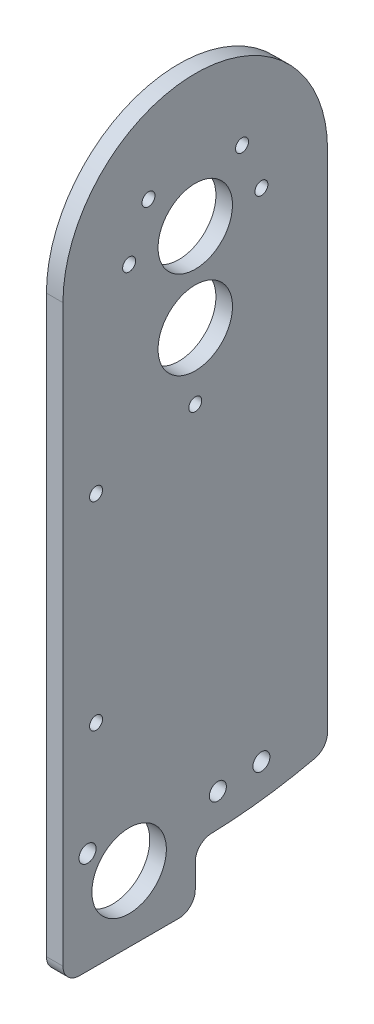
ISO-10303-21;
HEADER;
FILE_DESCRIPTION(('STEP AP214'),'2;1');
FILE_NAME('part.step','',(''),(''),'','','');
FILE_SCHEMA(('AUTOMOTIVE_DESIGN { 1 0 10303 214 1 1 1 1 }'));
ENDSEC;
DATA;
#1=APPLICATION_CONTEXT('core data for automotive mechanical design processes');
#2=APPLICATION_PROTOCOL_DEFINITION('international standard','automotive_design',2000,#1);
#3=PRODUCT_CONTEXT('',#1,'mechanical');
#4=PRODUCT('Part','Part','',(#3));
#5=PRODUCT_RELATED_PRODUCT_CATEGORY('part','',(#4));
#6=PRODUCT_DEFINITION_FORMATION('','',#4);
#7=PRODUCT_DEFINITION_CONTEXT('part definition',#1,'design');
#8=PRODUCT_DEFINITION('design','',#6,#7);
#9=PRODUCT_DEFINITION_SHAPE('','',#8);
#10=(LENGTH_UNIT() NAMED_UNIT(*) SI_UNIT(.MILLI.,.METRE.));
#11=(NAMED_UNIT(*) PLANE_ANGLE_UNIT() SI_UNIT($,.RADIAN.));
#12=(NAMED_UNIT(*) SI_UNIT($,.STERADIAN.) SOLID_ANGLE_UNIT());
#13=UNCERTAINTY_MEASURE_WITH_UNIT(LENGTH_MEASURE(1.E-05),#10,'distance_accuracy_value','');
#14=(GEOMETRIC_REPRESENTATION_CONTEXT(3) GLOBAL_UNCERTAINTY_ASSIGNED_CONTEXT((#13)) GLOBAL_UNIT_ASSIGNED_CONTEXT((#10,
#11,#12)) REPRESENTATION_CONTEXT('',''));
#15=CARTESIAN_POINT('',(0.,0.,0.));
#16=DIRECTION('',(0.,0.,1.));
#17=DIRECTION('',(1.,0.,0.));
#18=AXIS2_PLACEMENT_3D('',#15,#16,#17);
#19=CARTESIAN_POINT('',(6.35,0.,0.));
#20=DIRECTION('',(-1.,0.,0.));
#21=DIRECTION('',(0.,0.,1.));
#22=AXIS2_PLACEMENT_3D('',#19,#20,#21);
#23=PLANE('',#22);
#24=CARTESIAN_POINT('',(6.35,-201.606249903122,25.4));
#25=DIRECTION('',(-1.,0.,0.));
#26=DIRECTION('',(0.,0.,1.));
#27=AXIS2_PLACEMENT_3D('',#24,#25,#26);
#28=CIRCLE('',#27,14.2875);
#29=CARTESIAN_POINT('',(6.35,-201.606249903122,39.6875));
#30=VERTEX_POINT('',#29);
#31=EDGE_CURVE('E237',#30,#30,#28,.T.);
#32=ORIENTED_EDGE('',*,*,#31,.T.);
#33=EDGE_LOOP('',(#32));
#34=FACE_BOUND('',#33,.T.);
#35=CARTESIAN_POINT('',(6.34999999999999,0.,25.4));
#36=DIRECTION('',(-1.,0.,0.));
#37=DIRECTION('',(0.,0.,1.));
#38=AXIS2_PLACEMENT_3D('',#35,#36,#37);
#39=CIRCLE('',#38,2.48919999999999);
#40=CARTESIAN_POINT('',(6.34999999999999,0.,27.8892));
#41=VERTEX_POINT('',#40);
#42=EDGE_CURVE('E251',#41,#41,#39,.T.);
#43=ORIENTED_EDGE('',*,*,#42,.T.);
#44=EDGE_LOOP('',(#43));
#45=FACE_BOUND('',#44,.T.);
#46=CARTESIAN_POINT('',(6.34999999999999,0.,-25.4));
#47=DIRECTION('',(-1.,0.,0.));
#48=DIRECTION('',(0.,0.,1.));
#49=AXIS2_PLACEMENT_3D('',#46,#47,#48);
#50=CIRCLE('',#49,2.48919999999999);
#51=CARTESIAN_POINT('',(6.34999999999999,0.,-22.9108));
#52=VERTEX_POINT('',#51);
#53=EDGE_CURVE('E259',#52,#52,#50,.T.);
#54=ORIENTED_EDGE('',*,*,#53,.T.);
#55=EDGE_LOOP('',(#54));
#56=FACE_BOUND('',#55,.T.);
#57=CARTESIAN_POINT('',(6.34999999999999,17.9605122421383,-17.9605122421383));
#58=DIRECTION('',(-1.,0.,0.));
#59=DIRECTION('',(0.,0.,1.));
#60=AXIS2_PLACEMENT_3D('',#57,#58,#59);
#61=CIRCLE('',#60,2.48919999999999);
#62=CARTESIAN_POINT('',(6.34999999999999,17.9605122421383,-15.4713122421383));
#63=VERTEX_POINT('',#62);
#64=EDGE_CURVE('E267',#63,#63,#61,.T.);
#65=ORIENTED_EDGE('',*,*,#64,.T.);
#66=EDGE_LOOP('',(#65));
#67=FACE_BOUND('',#66,.T.);
#68=CARTESIAN_POINT('',(6.34999999999999,17.9605122421383,17.9605122421383));
#69=DIRECTION('',(-1.,0.,0.));
#70=DIRECTION('',(0.,0.,1.));
#71=AXIS2_PLACEMENT_3D('',#68,#69,#70);
#72=CIRCLE('',#71,2.48919999999999);
#73=CARTESIAN_POINT('',(6.34999999999999,17.9605122421383,20.4497122421383));
#74=VERTEX_POINT('',#73);
#75=EDGE_CURVE('E275',#74,#74,#72,.T.);
#76=ORIENTED_EDGE('',*,*,#75,.T.);
#77=EDGE_LOOP('',(#76));
#78=FACE_BOUND('',#77,.T.);
#79=CARTESIAN_POINT('',(6.34999999999999,-59.182,0.));
#80=DIRECTION('',(-1.,0.,0.));
#81=DIRECTION('',(0.,0.,1.));
#82=AXIS2_PLACEMENT_3D('',#79,#80,#81);
#83=CIRCLE('',#82,2.48919999999999);
#84=CARTESIAN_POINT('',(6.34999999999999,-59.182,2.48919999999999));
#85=VERTEX_POINT('',#84);
#86=EDGE_CURVE('E283',#85,#85,#83,.T.);
#87=ORIENTED_EDGE('',*,*,#86,.T.);
#88=EDGE_LOOP('',(#87));
#89=FACE_BOUND('',#88,.T.);
#90=CARTESIAN_POINT('',(6.35,-146.05,38.1));
#91=DIRECTION('',(1.,0.,0.));
#92=DIRECTION('',(0.,0.,-1.));
#93=AXIS2_PLACEMENT_3D('',#90,#91,#92);
#94=CIRCLE('',#93,2.4892);
#95=CARTESIAN_POINT('',(6.35,-146.05,35.6108));
#96=VERTEX_POINT('',#95);
#97=EDGE_CURVE('E287',#96,#96,#94,.T.);
#98=ORIENTED_EDGE('',*,*,#97,.F.);
#99=EDGE_LOOP('',(#98));
#100=FACE_BOUND('',#99,.T.);
#101=CARTESIAN_POINT('',(6.35,-69.85,38.1));
#102=DIRECTION('',(1.,0.,0.));
#103=DIRECTION('',(0.,0.,-1.));
#104=AXIS2_PLACEMENT_3D('',#101,#102,#103);
#105=CIRCLE('',#104,2.48919999999998);
#106=CARTESIAN_POINT('',(6.35,-69.85,35.6108));
#107=VERTEX_POINT('',#106);
#108=EDGE_CURVE('E295',#107,#107,#105,.T.);
#109=ORIENTED_EDGE('',*,*,#108,.F.);
#110=EDGE_LOOP('',(#109));
#111=FACE_BOUND('',#110,.T.);
#112=CARTESIAN_POINT('',(6.35,-192.209068040787,-8.68090939314916));
#113=DIRECTION('',(1.,0.,0.));
#114=DIRECTION('',(0.,0.,-1.));
#115=AXIS2_PLACEMENT_3D('',#112,#113,#114);
#116=CIRCLE('',#115,3.26389999999999);
#117=CARTESIAN_POINT('',(6.35,-192.209068040787,-11.9448093931491));
#118=VERTEX_POINT('',#117);
#119=EDGE_CURVE('E311',#118,#118,#116,.T.);
#120=ORIENTED_EDGE('',*,*,#119,.F.);
#121=EDGE_LOOP('',(#120));
#122=FACE_BOUND('',#121,.T.);
#123=CARTESIAN_POINT('',(6.35,-187.906487547305,41.362252871844));
#124=DIRECTION('',(1.,0.,0.));
#125=DIRECTION('',(0.,0.,-1.));
#126=AXIS2_PLACEMENT_3D('',#123,#124,#125);
#127=CIRCLE('',#126,3.26389999999999);
#128=CARTESIAN_POINT('',(6.35,-187.906487547305,38.098352871844));
#129=VERTEX_POINT('',#128);
#130=EDGE_CURVE('E319',#129,#129,#127,.T.);
#131=ORIENTED_EDGE('',*,*,#130,.F.);
#132=EDGE_LOOP('',(#131));
#133=FACE_BOUND('',#132,.T.);
#134=DIRECTION('',(0.,0.,-1.));
#135=VECTOR('',#134,1.);
#136=CARTESIAN_POINT('',(6.35,-227.006249903122,50.8));
#137=LINE('',#136,#135);
#138=CARTESIAN_POINT('',(6.35,-227.006249903122,44.4499999999999));
#139=VERTEX_POINT('',#138);
#140=CARTESIAN_POINT('',(6.35,-227.006249903122,6.35000000000001));
#141=VERTEX_POINT('',#140);
#142=EDGE_CURVE('E240',#139,#141,#137,.T.);
#143=ORIENTED_EDGE('',*,*,#142,.T.);
#144=CARTESIAN_POINT('',(6.35,-220.656249903122,6.35000000000001));
#145=DIRECTION('',(-1.,0.,0.));
#146=DIRECTION('',(0.,0.,1.));
#147=AXIS2_PLACEMENT_3D('',#144,#145,#146);
#148=CIRCLE('',#147,6.35);
#149=CARTESIAN_POINT('',(6.35,-220.656249903122,0.));
#150=VERTEX_POINT('',#149);
#151=EDGE_CURVE('E185',#141,#150,#148,.F.);
#152=ORIENTED_EDGE('',*,*,#151,.T.);
#153=DIRECTION('',(0.,1.,0.));
#154=VECTOR('',#153,1.);
#155=CARTESIAN_POINT('',(6.35,-227.006249903122,0.));
#156=LINE('',#155,#154);
#157=CARTESIAN_POINT('',(6.35,-211.359633149284,0.));
#158=VERTEX_POINT('',#157);
#159=EDGE_CURVE('E205',#150,#158,#156,.T.);
#160=ORIENTED_EDGE('',*,*,#159,.T.);
#161=CARTESIAN_POINT('',(6.35,-211.359633149284,-6.34999999999999));
#162=DIRECTION('',(-1.,0.,0.));
#163=DIRECTION('',(0.,0.,1.));
#164=AXIS2_PLACEMENT_3D('',#161,#162,#163);
#165=CIRCLE('',#164,6.35);
#166=CARTESIAN_POINT('',(6.35,-205.012497018675,-6.1593093093093));
#167=VERTEX_POINT('',#166);
#168=EDGE_CURVE('E54',#158,#167,#165,.T.);
#169=ORIENTED_EDGE('',*,*,#168,.T.);
#170=CARTESIAN_POINT('',(6.35,0.,0.));
#171=DIRECTION('',(1.,0.,0.));
#172=DIRECTION('',(0.,0.,-1.));
#173=AXIS2_PLACEMENT_3D('',#170,#171,#172);
#174=CIRCLE('',#173,205.105);
#175=CARTESIAN_POINT('',(6.35,-199.909960734882,-45.8701277955272));
#176=VERTEX_POINT('',#175);
#177=EDGE_CURVE('E135',#167,#176,#174,.T.);
#178=ORIENTED_EDGE('',*,*,#177,.T.);
#179=CARTESIAN_POINT('',(6.35,-193.720797863833,-44.45));
#180=DIRECTION('',(-1.,0.,0.));
#181=DIRECTION('',(0.,0.,1.));
#182=AXIS2_PLACEMENT_3D('',#179,#180,#181);
#183=CIRCLE('',#182,6.35);
#184=CARTESIAN_POINT('',(6.35,-193.720797863833,-50.8));
#185=VERTEX_POINT('',#184);
#186=EDGE_CURVE('E179',#176,#185,#183,.F.);
#187=ORIENTED_EDGE('',*,*,#186,.T.);
#188=DIRECTION('',(0.,1.,0.));
#189=VECTOR('',#188,1.);
#190=CARTESIAN_POINT('',(6.35,0.,-50.8));
#191=LINE('',#190,#189);
#192=CARTESIAN_POINT('',(6.35,0.,-50.8));
#193=VERTEX_POINT('',#192);
#194=EDGE_CURVE('E142',#185,#193,#191,.T.);
#195=ORIENTED_EDGE('',*,*,#194,.T.);
#196=CARTESIAN_POINT('',(6.35,0.,0.));
#197=DIRECTION('',(1.,0.,0.));
#198=DIRECTION('',(0.,0.,1.));
#199=AXIS2_PLACEMENT_3D('',#196,#197,#198);
#200=CIRCLE('',#199,50.8);
#201=CARTESIAN_POINT('',(6.35,0.,50.8));
#202=VERTEX_POINT('',#201);
#203=EDGE_CURVE('E136',#193,#202,#200,.T.);
#204=ORIENTED_EDGE('',*,*,#203,.T.);
#205=DIRECTION('',(0.,-1.,0.));
#206=VECTOR('',#205,1.);
#207=CARTESIAN_POINT('',(6.35,0.,50.8));
#208=LINE('',#207,#206);
#209=CARTESIAN_POINT('',(6.35,-220.656249903122,50.7999999999999));
#210=VERTEX_POINT('',#209);
#211=EDGE_CURVE('E125',#202,#210,#208,.T.);
#212=ORIENTED_EDGE('',*,*,#211,.T.);
#213=CARTESIAN_POINT('',(6.35,-220.656249903122,44.4499999999999));
#214=DIRECTION('',(-1.,0.,0.));
#215=DIRECTION('',(0.,0.,1.));
#216=AXIS2_PLACEMENT_3D('',#213,#214,#215);
#217=CIRCLE('',#216,6.35);
#218=EDGE_CURVE('E182',#210,#139,#217,.F.);
#219=ORIENTED_EDGE('',*,*,#218,.T.);
#220=EDGE_LOOP('',(#143,#152,#160,#169,#178,#187,#195,#204,#212,#219));
#221=FACE_BOUND('',#220,.T.);
#222=CARTESIAN_POINT('',(6.35,0.,0.));
#223=DIRECTION('',(1.,0.,0.));
#224=DIRECTION('',(0.,0.,-1.));
#225=AXIS2_PLACEMENT_3D('',#222,#223,#224);
#226=CIRCLE('',#225,14.2875);
#227=CARTESIAN_POINT('',(6.35,0.,-14.2875));
#228=VERTEX_POINT('',#227);
#229=EDGE_CURVE('E336',#228,#228,#226,.T.);
#230=ORIENTED_EDGE('',*,*,#229,.F.);
#231=EDGE_LOOP('',(#230));
#232=FACE_BOUND('',#231,.T.);
#233=CARTESIAN_POINT('',(6.35,-33.782,0.));
#234=DIRECTION('',(1.,0.,0.));
#235=DIRECTION('',(0.,0.,-1.));
#236=AXIS2_PLACEMENT_3D('',#233,#234,#235);
#237=CIRCLE('',#236,14.2875);
#238=CARTESIAN_POINT('',(6.35,-33.782,-14.2875));
#239=VERTEX_POINT('',#238);
#240=EDGE_CURVE('E328',#239,#239,#237,.T.);
#241=ORIENTED_EDGE('',*,*,#240,.F.);
#242=EDGE_LOOP('',(#241));
#243=FACE_BOUND('',#242,.T.);
#244=CARTESIAN_POINT('',(6.35,-190.721063401503,-25.4));
#245=DIRECTION('',(1.,0.,0.));
#246=DIRECTION('',(0.,0.,-1.));
#247=AXIS2_PLACEMENT_3D('',#244,#245,#246);
#248=CIRCLE('',#247,3.26389999999999);
#249=CARTESIAN_POINT('',(6.35,-190.721063401503,-28.6639));
#250=VERTEX_POINT('',#249);
#251=EDGE_CURVE('E303',#250,#250,#248,.T.);
#252=ORIENTED_EDGE('',*,*,#251,.F.);
#253=EDGE_LOOP('',(#252));
#254=FACE_BOUND('',#253,.T.);
#255=ADVANCED_FACE('F45',(#34,#45,#56,#67,#78,#89,#100,#111,#122,#133,#221,#232,#243,#254),#23,.F.);
#256=CARTESIAN_POINT('',(0.,0.,0.));
#257=DIRECTION('',(-1.,0.,0.));
#258=DIRECTION('',(0.,0.,1.));
#259=AXIS2_PLACEMENT_3D('',#256,#257,#258);
#260=PLANE('',#259);
#261=CARTESIAN_POINT('',(0.,-201.606249903122,25.4));
#262=DIRECTION('',(-1.,0.,0.));
#263=DIRECTION('',(0.,0.,1.));
#264=AXIS2_PLACEMENT_3D('',#261,#262,#263);
#265=CIRCLE('',#264,14.2875);
#266=CARTESIAN_POINT('',(0.,-201.606249903122,39.6875));
#267=VERTEX_POINT('',#266);
#268=EDGE_CURVE('E228',#267,#267,#265,.T.);
#269=ORIENTED_EDGE('',*,*,#268,.F.);
#270=EDGE_LOOP('',(#269));
#271=FACE_BOUND('',#270,.T.);
#272=DIRECTION('',(0.,1.,0.));
#273=VECTOR('',#272,1.);
#274=CARTESIAN_POINT('',(0.,-227.006249903122,0.));
#275=LINE('',#274,#273);
#276=CARTESIAN_POINT('',(0.,-220.656249903122,0.));
#277=VERTEX_POINT('',#276);
#278=CARTESIAN_POINT('',(0.,-211.359633149284,0.));
#279=VERTEX_POINT('',#278);
#280=EDGE_CURVE('E221',#277,#279,#275,.T.);
#281=ORIENTED_EDGE('',*,*,#280,.F.);
#282=CARTESIAN_POINT('',(0.,-220.656249903122,6.35000000000001));
#283=DIRECTION('',(-1.,0.,0.));
#284=DIRECTION('',(0.,0.,1.));
#285=AXIS2_PLACEMENT_3D('',#282,#283,#284);
#286=CIRCLE('',#285,6.35);
#287=CARTESIAN_POINT('',(0.,-227.006249903122,6.35000000000001));
#288=VERTEX_POINT('',#287);
#289=EDGE_CURVE('E192',#277,#288,#286,.T.);
#290=ORIENTED_EDGE('',*,*,#289,.T.);
#291=DIRECTION('',(0.,0.,-1.));
#292=VECTOR('',#291,1.);
#293=CARTESIAN_POINT('',(0.,-227.006249903122,50.8));
#294=LINE('',#293,#292);
#295=CARTESIAN_POINT('',(0.,-227.006249903122,44.4499999999999));
#296=VERTEX_POINT('',#295);
#297=EDGE_CURVE('E229',#296,#288,#294,.T.);
#298=ORIENTED_EDGE('',*,*,#297,.F.);
#299=CARTESIAN_POINT('',(0.,-220.656249903122,44.4499999999999));
#300=DIRECTION('',(-1.,0.,0.));
#301=DIRECTION('',(0.,0.,1.));
#302=AXIS2_PLACEMENT_3D('',#299,#300,#301);
#303=CIRCLE('',#302,6.35);
#304=CARTESIAN_POINT('',(0.,-220.656249903122,50.7999999999999));
#305=VERTEX_POINT('',#304);
#306=EDGE_CURVE('E69',#296,#305,#303,.T.);
#307=ORIENTED_EDGE('',*,*,#306,.T.);
#308=DIRECTION('',(0.,-1.,0.));
#309=VECTOR('',#308,1.);
#310=CARTESIAN_POINT('',(0.,0.,50.8));
#311=LINE('',#310,#309);
#312=CARTESIAN_POINT('',(0.,0.,50.8));
#313=VERTEX_POINT('',#312);
#314=EDGE_CURVE('E347',#313,#305,#311,.T.);
#315=ORIENTED_EDGE('',*,*,#314,.F.);
#316=CARTESIAN_POINT('',(0.,0.,0.));
#317=DIRECTION('',(1.,0.,0.));
#318=DIRECTION('',(0.,0.,1.));
#319=AXIS2_PLACEMENT_3D('',#316,#317,#318);
#320=CIRCLE('',#319,50.8);
#321=CARTESIAN_POINT('',(0.,0.,-50.8));
#322=VERTEX_POINT('',#321);
#323=EDGE_CURVE('E151',#322,#313,#320,.T.);
#324=ORIENTED_EDGE('',*,*,#323,.F.);
#325=DIRECTION('',(0.,1.,0.));
#326=VECTOR('',#325,1.);
#327=CARTESIAN_POINT('',(0.,0.,-50.8));
#328=LINE('',#327,#326);
#329=CARTESIAN_POINT('',(0.,-193.720797863833,-50.8));
#330=VERTEX_POINT('',#329);
#331=EDGE_CURVE('E147',#330,#322,#328,.T.);
#332=ORIENTED_EDGE('',*,*,#331,.F.);
#333=CARTESIAN_POINT('',(0.,-193.720797863833,-44.45));
#334=DIRECTION('',(-1.,0.,0.));
#335=DIRECTION('',(0.,0.,1.));
#336=AXIS2_PLACEMENT_3D('',#333,#334,#335);
#337=CIRCLE('',#336,6.35);
#338=CARTESIAN_POINT('',(0.,-199.909960734882,-45.8701277955272));
#339=VERTEX_POINT('',#338);
#340=EDGE_CURVE('E61',#330,#339,#337,.T.);
#341=ORIENTED_EDGE('',*,*,#340,.T.);
#342=CARTESIAN_POINT('',(0.,0.,0.));
#343=DIRECTION('',(1.,0.,0.));
#344=DIRECTION('',(0.,0.,-1.));
#345=AXIS2_PLACEMENT_3D('',#342,#343,#344);
#346=CIRCLE('',#345,205.105);
#347=CARTESIAN_POINT('',(0.,-205.012497018675,-6.1593093093093));
#348=VERTEX_POINT('',#347);
#349=EDGE_CURVE('E223',#348,#339,#346,.T.);
#350=ORIENTED_EDGE('',*,*,#349,.F.);
#351=CARTESIAN_POINT('',(0.,-211.359633149284,-6.34999999999999));
#352=DIRECTION('',(-1.,0.,0.));
#353=DIRECTION('',(0.,0.,1.));
#354=AXIS2_PLACEMENT_3D('',#351,#352,#353);
#355=CIRCLE('',#354,6.35);
#356=EDGE_CURVE('E11',#348,#279,#355,.F.);
#357=ORIENTED_EDGE('',*,*,#356,.T.);
#358=EDGE_LOOP('',(#281,#290,#298,#307,#315,#324,#332,#341,#350,#357));
#359=FACE_BOUND('',#358,.T.);
#360=CARTESIAN_POINT('',(0.,0.,25.4));
#361=DIRECTION('',(-1.,0.,0.));
#362=DIRECTION('',(0.,0.,1.));
#363=AXIS2_PLACEMENT_3D('',#360,#361,#362);
#364=CIRCLE('',#363,2.48919999999999);
#365=CARTESIAN_POINT('',(0.,0.,27.8892));
#366=VERTEX_POINT('',#365);
#367=EDGE_CURVE('E234',#366,#366,#364,.T.);
#368=ORIENTED_EDGE('',*,*,#367,.F.);
#369=EDGE_LOOP('',(#368));
#370=FACE_BOUND('',#369,.T.);
#371=CARTESIAN_POINT('',(0.,0.,-25.4));
#372=DIRECTION('',(-1.,0.,0.));
#373=DIRECTION('',(0.,0.,1.));
#374=AXIS2_PLACEMENT_3D('',#371,#372,#373);
#375=CIRCLE('',#374,2.48919999999999);
#376=CARTESIAN_POINT('',(0.,0.,-22.9108));
#377=VERTEX_POINT('',#376);
#378=EDGE_CURVE('E255',#377,#377,#375,.T.);
#379=ORIENTED_EDGE('',*,*,#378,.F.);
#380=EDGE_LOOP('',(#379));
#381=FACE_BOUND('',#380,.T.);
#382=CARTESIAN_POINT('',(0.,17.9605122421383,-17.9605122421383));
#383=DIRECTION('',(-1.,0.,0.));
#384=DIRECTION('',(0.,0.,1.));
#385=AXIS2_PLACEMENT_3D('',#382,#383,#384);
#386=CIRCLE('',#385,2.48919999999999);
#387=CARTESIAN_POINT('',(0.,17.9605122421383,-15.4713122421383));
#388=VERTEX_POINT('',#387);
#389=EDGE_CURVE('E263',#388,#388,#386,.T.);
#390=ORIENTED_EDGE('',*,*,#389,.F.);
#391=EDGE_LOOP('',(#390));
#392=FACE_BOUND('',#391,.T.);
#393=CARTESIAN_POINT('',(0.,17.9605122421383,17.9605122421383));
#394=DIRECTION('',(-1.,0.,0.));
#395=DIRECTION('',(0.,0.,1.));
#396=AXIS2_PLACEMENT_3D('',#393,#394,#395);
#397=CIRCLE('',#396,2.48919999999999);
#398=CARTESIAN_POINT('',(0.,17.9605122421383,20.4497122421383));
#399=VERTEX_POINT('',#398);
#400=EDGE_CURVE('E271',#399,#399,#397,.T.);
#401=ORIENTED_EDGE('',*,*,#400,.F.);
#402=EDGE_LOOP('',(#401));
#403=FACE_BOUND('',#402,.T.);
#404=CARTESIAN_POINT('',(0.,-59.182,0.));
#405=DIRECTION('',(-1.,0.,0.));
#406=DIRECTION('',(0.,0.,1.));
#407=AXIS2_PLACEMENT_3D('',#404,#405,#406);
#408=CIRCLE('',#407,2.48919999999999);
#409=CARTESIAN_POINT('',(0.,-59.182,2.48919999999999));
#410=VERTEX_POINT('',#409);
#411=EDGE_CURVE('E279',#410,#410,#408,.T.);
#412=ORIENTED_EDGE('',*,*,#411,.F.);
#413=EDGE_LOOP('',(#412));
#414=FACE_BOUND('',#413,.T.);
#415=CARTESIAN_POINT('',(0.,-146.05,38.1));
#416=DIRECTION('',(1.,0.,0.));
#417=DIRECTION('',(0.,0.,-1.));
#418=AXIS2_PLACEMENT_3D('',#415,#416,#417);
#419=CIRCLE('',#418,2.4892);
#420=CARTESIAN_POINT('',(0.,-146.05,35.6108));
#421=VERTEX_POINT('',#420);
#422=EDGE_CURVE('E291',#421,#421,#419,.T.);
#423=ORIENTED_EDGE('',*,*,#422,.T.);
#424=EDGE_LOOP('',(#423));
#425=FACE_BOUND('',#424,.T.);
#426=CARTESIAN_POINT('',(0.,-69.85,38.1));
#427=DIRECTION('',(1.,0.,0.));
#428=DIRECTION('',(0.,0.,-1.));
#429=AXIS2_PLACEMENT_3D('',#426,#427,#428);
#430=CIRCLE('',#429,2.4892);
#431=CARTESIAN_POINT('',(0.,-69.85,35.6108));
#432=VERTEX_POINT('',#431);
#433=EDGE_CURVE('E299',#432,#432,#430,.T.);
#434=ORIENTED_EDGE('',*,*,#433,.T.);
#435=EDGE_LOOP('',(#434));
#436=FACE_BOUND('',#435,.T.);
#437=CARTESIAN_POINT('',(0.,-190.721063401503,-25.4));
#438=DIRECTION('',(1.,0.,0.));
#439=DIRECTION('',(0.,0.,-1.));
#440=AXIS2_PLACEMENT_3D('',#437,#438,#439);
#441=CIRCLE('',#440,3.26389999999999);
#442=CARTESIAN_POINT('',(0.,-190.721063401503,-28.6639));
#443=VERTEX_POINT('',#442);
#444=EDGE_CURVE('E307',#443,#443,#441,.T.);
#445=ORIENTED_EDGE('',*,*,#444,.T.);
#446=EDGE_LOOP('',(#445));
#447=FACE_BOUND('',#446,.T.);
#448=CARTESIAN_POINT('',(0.,-192.209068040787,-8.68090939314916));
#449=DIRECTION('',(1.,0.,0.));
#450=DIRECTION('',(0.,0.,-1.));
#451=AXIS2_PLACEMENT_3D('',#448,#449,#450);
#452=CIRCLE('',#451,3.26389999999999);
#453=CARTESIAN_POINT('',(0.,-192.209068040787,-11.9448093931491));
#454=VERTEX_POINT('',#453);
#455=EDGE_CURVE('E315',#454,#454,#452,.T.);
#456=ORIENTED_EDGE('',*,*,#455,.T.);
#457=EDGE_LOOP('',(#456));
#458=FACE_BOUND('',#457,.T.);
#459=CARTESIAN_POINT('',(0.,-187.906487547305,41.362252871844));
#460=DIRECTION('',(1.,0.,0.));
#461=DIRECTION('',(0.,0.,-1.));
#462=AXIS2_PLACEMENT_3D('',#459,#460,#461);
#463=CIRCLE('',#462,3.26389999999999);
#464=CARTESIAN_POINT('',(0.,-187.906487547305,38.098352871844));
#465=VERTEX_POINT('',#464);
#466=EDGE_CURVE('E323',#465,#465,#463,.T.);
#467=ORIENTED_EDGE('',*,*,#466,.T.);
#468=EDGE_LOOP('',(#467));
#469=FACE_BOUND('',#468,.T.);
#470=CARTESIAN_POINT('',(0.,0.,0.));
#471=DIRECTION('',(1.,0.,0.));
#472=DIRECTION('',(0.,0.,-1.));
#473=AXIS2_PLACEMENT_3D('',#470,#471,#472);
#474=CIRCLE('',#473,14.2875);
#475=CARTESIAN_POINT('',(0.,0.,-14.2875));
#476=VERTEX_POINT('',#475);
#477=EDGE_CURVE('E332',#476,#476,#474,.T.);
#478=ORIENTED_EDGE('',*,*,#477,.T.);
#479=EDGE_LOOP('',(#478));
#480=FACE_BOUND('',#479,.T.);
#481=CARTESIAN_POINT('',(0.,-33.782,0.));
#482=DIRECTION('',(1.,0.,0.));
#483=DIRECTION('',(0.,0.,-1.));
#484=AXIS2_PLACEMENT_3D('',#481,#482,#483);
#485=CIRCLE('',#484,14.2875);
#486=CARTESIAN_POINT('',(0.,-33.782,-14.2875));
#487=VERTEX_POINT('',#486);
#488=EDGE_CURVE('E327',#487,#487,#485,.T.);
#489=ORIENTED_EDGE('',*,*,#488,.T.);
#490=EDGE_LOOP('',(#489));
#491=FACE_BOUND('',#490,.T.);
#492=ADVANCED_FACE('F219',(#271,#359,#370,#381,#392,#403,#414,#425,#436,#447,#458,#469,#480,
#491),#260,.T.);
#493=CARTESIAN_POINT('',(6.35,0.,0.));
#494=DIRECTION('',(-1.,0.,0.));
#495=DIRECTION('',(0.,0.,1.));
#496=AXIS2_PLACEMENT_3D('',#493,#494,#495);
#497=CYLINDRICAL_SURFACE('',#496,50.8);
#498=ORIENTED_EDGE('',*,*,#323,.T.);
#499=DIRECTION('',(-1.,0.,0.));
#500=VECTOR('',#499,1.);
#501=CARTESIAN_POINT('',(6.35,0.,50.8));
#502=LINE('',#501,#500);
#503=EDGE_CURVE('E129',#202,#313,#502,.T.);
#504=ORIENTED_EDGE('',*,*,#503,.F.);
#505=ORIENTED_EDGE('',*,*,#203,.F.);
#506=DIRECTION('',(-1.,0.,0.));
#507=VECTOR('',#506,1.);
#508=CARTESIAN_POINT('',(6.35,0.,-50.8));
#509=LINE('',#508,#507);
#510=EDGE_CURVE('E154',#193,#322,#509,.T.);
#511=ORIENTED_EDGE('',*,*,#510,.T.);
#512=EDGE_LOOP('',(#498,#504,#505,#511));
#513=FACE_BOUND('',#512,.T.);
#514=ADVANCED_FACE('F149',(#513),#497,.T.);
#515=CARTESIAN_POINT('',(6.35,0.,50.8));
#516=DIRECTION('',(0.,0.,-1.));
#517=DIRECTION('',(0.,1.,0.));
#518=AXIS2_PLACEMENT_3D('',#515,#516,#517);
#519=PLANE('',#518);
#520=ORIENTED_EDGE('',*,*,#314,.T.);
#521=DIRECTION('',(1.,0.,0.));
#522=VECTOR('',#521,1.);
#523=CARTESIAN_POINT('',(6.35,-220.656249903122,50.7999999999999));
#524=LINE('',#523,#522);
#525=EDGE_CURVE('E132',#305,#210,#524,.T.);
#526=ORIENTED_EDGE('',*,*,#525,.T.);
#527=ORIENTED_EDGE('',*,*,#211,.F.);
#528=ORIENTED_EDGE('',*,*,#503,.T.);
#529=EDGE_LOOP('',(#520,#526,#527,#528));
#530=FACE_BOUND('',#529,.T.);
#531=ADVANCED_FACE('F127',(#530),#519,.F.);
#532=CARTESIAN_POINT('',(6.35,0.,0.));
#533=DIRECTION('',(-1.,0.,0.));
#534=DIRECTION('',(0.,0.,1.));
#535=AXIS2_PLACEMENT_3D('',#532,#533,#534);
#536=CYLINDRICAL_SURFACE('',#535,205.105);
#537=ORIENTED_EDGE('',*,*,#177,.F.);
#538=DIRECTION('',(-1.,0.,0.));
#539=VECTOR('',#538,1.);
#540=CARTESIAN_POINT('',(6.35,-205.012497018675,-6.1593093093093));
#541=LINE('',#540,#539);
#542=EDGE_CURVE('E169',#167,#348,#541,.T.);
#543=ORIENTED_EDGE('',*,*,#542,.T.);
#544=ORIENTED_EDGE('',*,*,#349,.T.);
#545=DIRECTION('',(-1.,0.,0.));
#546=VECTOR('',#545,1.);
#547=CARTESIAN_POINT('',(6.35,-199.909960734882,-45.8701277955272));
#548=LINE('',#547,#546);
#549=EDGE_CURVE('E166',#339,#176,#548,.F.);
#550=ORIENTED_EDGE('',*,*,#549,.T.);
#551=EDGE_LOOP('',(#537,#543,#544,#550));
#552=FACE_BOUND('',#551,.T.);
#553=ADVANCED_FACE('F210',(#552),#536,.T.);
#554=CARTESIAN_POINT('',(6.35,0.,-50.8));
#555=DIRECTION('',(0.,0.,1.));
#556=DIRECTION('',(0.,-1.,0.));
#557=AXIS2_PLACEMENT_3D('',#554,#555,#556);
#558=PLANE('',#557);
#559=ORIENTED_EDGE('',*,*,#194,.F.);
#560=DIRECTION('',(-1.,0.,0.));
#561=VECTOR('',#560,1.);
#562=CARTESIAN_POINT('',(6.35,-193.720797863833,-50.8));
#563=LINE('',#562,#561);
#564=EDGE_CURVE('E197',#185,#330,#563,.T.);
#565=ORIENTED_EDGE('',*,*,#564,.T.);
#566=ORIENTED_EDGE('',*,*,#331,.T.);
#567=ORIENTED_EDGE('',*,*,#510,.F.);
#568=EDGE_LOOP('',(#559,#565,#566,#567));
#569=FACE_BOUND('',#568,.T.);
#570=ADVANCED_FACE('F354',(#569),#558,.F.);
#571=CARTESIAN_POINT('',(6.35,0.,0.));
#572=DIRECTION('',(-1.,0.,0.));
#573=DIRECTION('',(0.,0.,1.));
#574=AXIS2_PLACEMENT_3D('',#571,#572,#573);
#575=CYLINDRICAL_SURFACE('',#574,14.2875);
#576=ORIENTED_EDGE('',*,*,#229,.T.);
#577=EDGE_LOOP('',(#576));
#578=FACE_BOUND('',#577,.T.);
#579=ORIENTED_EDGE('',*,*,#477,.F.);
#580=EDGE_LOOP('',(#579));
#581=FACE_BOUND('',#580,.T.);
#582=ADVANCED_FACE('F382',(#578,#581),#575,.F.);
#583=CARTESIAN_POINT('',(6.35,-33.782,0.));
#584=DIRECTION('',(-1.,0.,0.));
#585=DIRECTION('',(0.,0.,1.));
#586=AXIS2_PLACEMENT_3D('',#583,#584,#585);
#587=CYLINDRICAL_SURFACE('',#586,14.2875);
#588=ORIENTED_EDGE('',*,*,#240,.T.);
#589=EDGE_LOOP('',(#588));
#590=FACE_BOUND('',#589,.T.);
#591=ORIENTED_EDGE('',*,*,#488,.F.);
#592=EDGE_LOOP('',(#591));
#593=FACE_BOUND('',#592,.T.);
#594=ADVANCED_FACE('F403',(#590,#593),#587,.F.);
#595=CARTESIAN_POINT('',(6.35,-187.906487547305,41.362252871844));
#596=DIRECTION('',(1.,0.,0.));
#597=DIRECTION('',(0.,0.,-1.));
#598=AXIS2_PLACEMENT_3D('',#595,#596,#597);
#599=CYLINDRICAL_SURFACE('',#598,3.26389999999999);
#600=ORIENTED_EDGE('',*,*,#466,.F.);
#601=EDGE_LOOP('',(#600));
#602=FACE_BOUND('',#601,.T.);
#603=ORIENTED_EDGE('',*,*,#130,.T.);
#604=EDGE_LOOP('',(#603));
#605=FACE_BOUND('',#604,.T.);
#606=ADVANCED_FACE('F412',(#602,#605),#599,.F.);
#607=CARTESIAN_POINT('',(6.35,-192.209068040787,-8.68090939314916));
#608=DIRECTION('',(1.,0.,0.));
#609=DIRECTION('',(0.,0.,-1.));
#610=AXIS2_PLACEMENT_3D('',#607,#608,#609);
#611=CYLINDRICAL_SURFACE('',#610,3.26389999999999);
#612=ORIENTED_EDGE('',*,*,#455,.F.);
#613=EDGE_LOOP('',(#612));
#614=FACE_BOUND('',#613,.T.);
#615=ORIENTED_EDGE('',*,*,#119,.T.);
#616=EDGE_LOOP('',(#615));
#617=FACE_BOUND('',#616,.T.);
#618=ADVANCED_FACE('F421',(#614,#617),#611,.F.);
#619=CARTESIAN_POINT('',(6.35,-190.721063401503,-25.4));
#620=DIRECTION('',(1.,0.,0.));
#621=DIRECTION('',(0.,0.,-1.));
#622=AXIS2_PLACEMENT_3D('',#619,#620,#621);
#623=CYLINDRICAL_SURFACE('',#622,3.26389999999999);
#624=ORIENTED_EDGE('',*,*,#444,.F.);
#625=EDGE_LOOP('',(#624));
#626=FACE_BOUND('',#625,.T.);
#627=ORIENTED_EDGE('',*,*,#251,.T.);
#628=EDGE_LOOP('',(#627));
#629=FACE_BOUND('',#628,.T.);
#630=ADVANCED_FACE('F430',(#626,#629),#623,.F.);
#631=CARTESIAN_POINT('',(6.35,-69.85,38.1));
#632=DIRECTION('',(1.,0.,0.));
#633=DIRECTION('',(0.,0.,-1.));
#634=AXIS2_PLACEMENT_3D('',#631,#632,#633);
#635=CYLINDRICAL_SURFACE('',#634,2.48919999999999);
#636=ORIENTED_EDGE('',*,*,#433,.F.);
#637=EDGE_LOOP('',(#636));
#638=FACE_BOUND('',#637,.T.);
#639=ORIENTED_EDGE('',*,*,#108,.T.);
#640=EDGE_LOOP('',(#639));
#641=FACE_BOUND('',#640,.T.);
#642=ADVANCED_FACE('F439',(#638,#641),#635,.F.);
#643=CARTESIAN_POINT('',(6.35,-146.05,38.1));
#644=DIRECTION('',(1.,0.,0.));
#645=DIRECTION('',(0.,0.,-1.));
#646=AXIS2_PLACEMENT_3D('',#643,#644,#645);
#647=CYLINDRICAL_SURFACE('',#646,2.4892);
#648=ORIENTED_EDGE('',*,*,#422,.F.);
#649=EDGE_LOOP('',(#648));
#650=FACE_BOUND('',#649,.T.);
#651=ORIENTED_EDGE('',*,*,#97,.T.);
#652=EDGE_LOOP('',(#651));
#653=FACE_BOUND('',#652,.T.);
#654=ADVANCED_FACE('F448',(#650,#653),#647,.F.);
#655=CARTESIAN_POINT('',(0.,-59.182,0.));
#656=DIRECTION('',(-1.,0.,0.));
#657=DIRECTION('',(0.,0.,1.));
#658=AXIS2_PLACEMENT_3D('',#655,#656,#657);
#659=CYLINDRICAL_SURFACE('',#658,2.48919999999999);
#660=ORIENTED_EDGE('',*,*,#86,.F.);
#661=EDGE_LOOP('',(#660));
#662=FACE_BOUND('',#661,.T.);
#663=ORIENTED_EDGE('',*,*,#411,.T.);
#664=EDGE_LOOP('',(#663));
#665=FACE_BOUND('',#664,.T.);
#666=ADVANCED_FACE('F457',(#662,#665),#659,.F.);
#667=CARTESIAN_POINT('',(0.,17.9605122421383,17.9605122421383));
#668=DIRECTION('',(-1.,0.,0.));
#669=DIRECTION('',(0.,0.,1.));
#670=AXIS2_PLACEMENT_3D('',#667,#668,#669);
#671=CYLINDRICAL_SURFACE('',#670,2.48919999999999);
#672=ORIENTED_EDGE('',*,*,#75,.F.);
#673=EDGE_LOOP('',(#672));
#674=FACE_BOUND('',#673,.T.);
#675=ORIENTED_EDGE('',*,*,#400,.T.);
#676=EDGE_LOOP('',(#675));
#677=FACE_BOUND('',#676,.T.);
#678=ADVANCED_FACE('F466',(#674,#677),#671,.F.);
#679=CARTESIAN_POINT('',(0.,17.9605122421383,-17.9605122421383));
#680=DIRECTION('',(-1.,0.,0.));
#681=DIRECTION('',(0.,0.,1.));
#682=AXIS2_PLACEMENT_3D('',#679,#680,#681);
#683=CYLINDRICAL_SURFACE('',#682,2.48919999999999);
#684=ORIENTED_EDGE('',*,*,#64,.F.);
#685=EDGE_LOOP('',(#684));
#686=FACE_BOUND('',#685,.T.);
#687=ORIENTED_EDGE('',*,*,#389,.T.);
#688=EDGE_LOOP('',(#687));
#689=FACE_BOUND('',#688,.T.);
#690=ADVANCED_FACE('F475',(#686,#689),#683,.F.);
#691=CARTESIAN_POINT('',(0.,0.,-25.4));
#692=DIRECTION('',(-1.,0.,0.));
#693=DIRECTION('',(0.,0.,1.));
#694=AXIS2_PLACEMENT_3D('',#691,#692,#693);
#695=CYLINDRICAL_SURFACE('',#694,2.48919999999999);
#696=ORIENTED_EDGE('',*,*,#53,.F.);
#697=EDGE_LOOP('',(#696));
#698=FACE_BOUND('',#697,.T.);
#699=ORIENTED_EDGE('',*,*,#378,.T.);
#700=EDGE_LOOP('',(#699));
#701=FACE_BOUND('',#700,.T.);
#702=ADVANCED_FACE('F484',(#698,#701),#695,.F.);
#703=CARTESIAN_POINT('',(0.,0.,25.4));
#704=DIRECTION('',(-1.,0.,0.));
#705=DIRECTION('',(0.,0.,1.));
#706=AXIS2_PLACEMENT_3D('',#703,#704,#705);
#707=CYLINDRICAL_SURFACE('',#706,2.48919999999999);
#708=ORIENTED_EDGE('',*,*,#42,.F.);
#709=EDGE_LOOP('',(#708));
#710=FACE_BOUND('',#709,.T.);
#711=ORIENTED_EDGE('',*,*,#367,.T.);
#712=EDGE_LOOP('',(#711));
#713=FACE_BOUND('',#712,.T.);
#714=ADVANCED_FACE('F493',(#710,#713),#707,.F.);
#715=CARTESIAN_POINT('',(0.,-201.606249903122,25.4));
#716=DIRECTION('',(1.,0.,0.));
#717=DIRECTION('',(0.,0.,-1.));
#718=AXIS2_PLACEMENT_3D('',#715,#716,#717);
#719=CYLINDRICAL_SURFACE('',#718,14.2875);
#720=ORIENTED_EDGE('',*,*,#31,.F.);
#721=EDGE_LOOP('',(#720));
#722=FACE_BOUND('',#721,.T.);
#723=ORIENTED_EDGE('',*,*,#268,.T.);
#724=EDGE_LOOP('',(#723));
#725=FACE_BOUND('',#724,.T.);
#726=ADVANCED_FACE('F501',(#722,#725),#719,.F.);
#727=CARTESIAN_POINT('',(0.,-227.006249903122,0.));
#728=DIRECTION('',(0.,0.,-1.));
#729=DIRECTION('',(0.,1.,0.));
#730=AXIS2_PLACEMENT_3D('',#727,#728,#729);
#731=PLANE('',#730);
#732=ORIENTED_EDGE('',*,*,#280,.T.);
#733=DIRECTION('',(-1.,0.,0.));
#734=VECTOR('',#733,1.);
#735=CARTESIAN_POINT('',(0.,-211.359633149284,0.));
#736=LINE('',#735,#734);
#737=EDGE_CURVE('E158',#279,#158,#736,.F.);
#738=ORIENTED_EDGE('',*,*,#737,.T.);
#739=ORIENTED_EDGE('',*,*,#159,.F.);
#740=DIRECTION('',(1.,0.,0.));
#741=VECTOR('',#740,1.);
#742=CARTESIAN_POINT('',(0.,-220.656249903122,0.));
#743=LINE('',#742,#741);
#744=EDGE_CURVE('E153',#150,#277,#743,.F.);
#745=ORIENTED_EDGE('',*,*,#744,.T.);
#746=EDGE_LOOP('',(#732,#738,#739,#745));
#747=FACE_BOUND('',#746,.T.);
#748=ADVANCED_FACE('F225',(#747),#731,.T.);
#749=CARTESIAN_POINT('',(0.,-227.006249903122,50.8));
#750=DIRECTION('',(0.,-1.,0.));
#751=DIRECTION('',(0.,0.,-1.));
#752=AXIS2_PLACEMENT_3D('',#749,#750,#751);
#753=PLANE('',#752);
#754=ORIENTED_EDGE('',*,*,#297,.T.);
#755=DIRECTION('',(1.,0.,0.));
#756=VECTOR('',#755,1.);
#757=CARTESIAN_POINT('',(0.,-227.006249903122,6.35000000000001));
#758=LINE('',#757,#756);
#759=EDGE_CURVE('E175',#288,#141,#758,.T.);
#760=ORIENTED_EDGE('',*,*,#759,.T.);
#761=ORIENTED_EDGE('',*,*,#142,.F.);
#762=DIRECTION('',(1.,0.,0.));
#763=VECTOR('',#762,1.);
#764=CARTESIAN_POINT('',(0.,-227.006249903122,44.4499999999999));
#765=LINE('',#764,#763);
#766=EDGE_CURVE('E172',#139,#296,#765,.F.);
#767=ORIENTED_EDGE('',*,*,#766,.T.);
#768=EDGE_LOOP('',(#754,#760,#761,#767));
#769=FACE_BOUND('',#768,.T.);
#770=ADVANCED_FACE('F360',(#769),#753,.T.);
#771=CARTESIAN_POINT('',(6.35,-211.359633149284,-6.34999999999999));
#772=DIRECTION('',(-1.,0.,0.));
#773=DIRECTION('',(0.,0.,1.));
#774=AXIS2_PLACEMENT_3D('',#771,#772,#773);
#775=CYLINDRICAL_SURFACE('',#774,6.35);
#776=ORIENTED_EDGE('',*,*,#356,.F.);
#777=ORIENTED_EDGE('',*,*,#542,.F.);
#778=ORIENTED_EDGE('',*,*,#168,.F.);
#779=ORIENTED_EDGE('',*,*,#737,.F.);
#780=EDGE_LOOP('',(#776,#777,#778,#779));
#781=FACE_BOUND('',#780,.T.);
#782=ADVANCED_FACE('F216',(#781),#775,.F.);
#783=CARTESIAN_POINT('',(0.,-220.656249903122,6.35000000000001));
#784=DIRECTION('',(1.,0.,0.));
#785=DIRECTION('',(0.,0.,-1.));
#786=AXIS2_PLACEMENT_3D('',#783,#784,#785);
#787=CYLINDRICAL_SURFACE('',#786,6.35);
#788=ORIENTED_EDGE('',*,*,#289,.F.);
#789=ORIENTED_EDGE('',*,*,#744,.F.);
#790=ORIENTED_EDGE('',*,*,#151,.F.);
#791=ORIENTED_EDGE('',*,*,#759,.F.);
#792=EDGE_LOOP('',(#788,#789,#790,#791));
#793=FACE_BOUND('',#792,.T.);
#794=ADVANCED_FACE('F363',(#793),#787,.T.);
#795=CARTESIAN_POINT('',(6.35,-220.656249903122,44.4499999999999));
#796=DIRECTION('',(-1.,0.,0.));
#797=DIRECTION('',(0.,0.,1.));
#798=AXIS2_PLACEMENT_3D('',#795,#796,#797);
#799=CYLINDRICAL_SURFACE('',#798,6.35);
#800=ORIENTED_EDGE('',*,*,#306,.F.);
#801=ORIENTED_EDGE('',*,*,#766,.F.);
#802=ORIENTED_EDGE('',*,*,#218,.F.);
#803=ORIENTED_EDGE('',*,*,#525,.F.);
#804=EDGE_LOOP('',(#800,#801,#802,#803));
#805=FACE_BOUND('',#804,.T.);
#806=ADVANCED_FACE('F356',(#805),#799,.T.);
#807=CARTESIAN_POINT('',(6.35,-193.720797863833,-44.45));
#808=DIRECTION('',(-1.,0.,0.));
#809=DIRECTION('',(0.,0.,1.));
#810=AXIS2_PLACEMENT_3D('',#807,#808,#809);
#811=CYLINDRICAL_SURFACE('',#810,6.35);
#812=ORIENTED_EDGE('',*,*,#186,.F.);
#813=ORIENTED_EDGE('',*,*,#549,.F.);
#814=ORIENTED_EDGE('',*,*,#340,.F.);
#815=ORIENTED_EDGE('',*,*,#564,.F.);
#816=EDGE_LOOP('',(#812,#813,#814,#815));
#817=FACE_BOUND('',#816,.T.);
#818=ADVANCED_FACE('F47',(#817),#811,.T.);
#819=CLOSED_SHELL('',(#255,#492,#514,#531,#553,#570,#582,#594,#606,#618,#630,#642,#654,#666,
#678,#690,#702,#714,#726,#748,#770,#782,#794,#806,#818));
#820=MANIFOLD_SOLID_BREP('B2',#819);
#821=ADVANCED_BREP_SHAPE_REPRESENTATION('',(#18,#820),#14);
#822=SHAPE_DEFINITION_REPRESENTATION(#9,#821);
ENDSEC;
END-ISO-10303-21;
